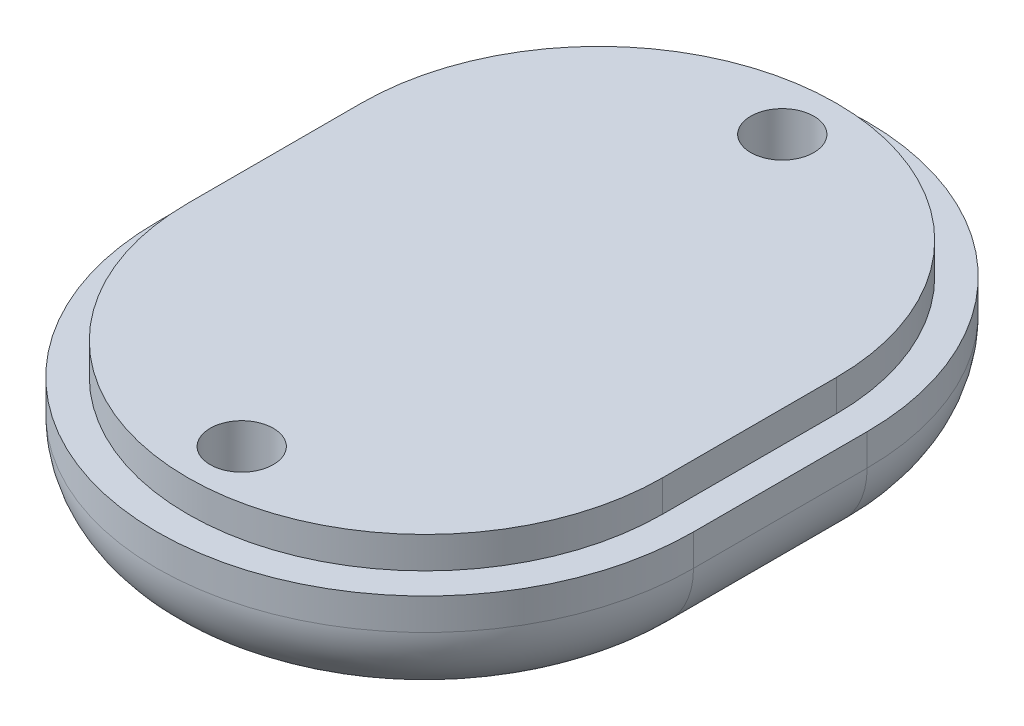
ISO-10303-21;
HEADER;
FILE_DESCRIPTION(('STEP AP214'),'2;1');
FILE_NAME('part.step','',(''),(''),'','','');
FILE_SCHEMA(('AUTOMOTIVE_DESIGN { 1 0 10303 214 1 1 1 1 }'));
ENDSEC;
DATA;
#1=APPLICATION_CONTEXT('core data for automotive mechanical design processes');
#2=APPLICATION_PROTOCOL_DEFINITION('international standard','automotive_design',2000,#1);
#3=PRODUCT_CONTEXT('',#1,'mechanical');
#4=PRODUCT('Part','Part','',(#3));
#5=PRODUCT_RELATED_PRODUCT_CATEGORY('part','',(#4));
#6=PRODUCT_DEFINITION_FORMATION('','',#4);
#7=PRODUCT_DEFINITION_CONTEXT('part definition',#1,'design');
#8=PRODUCT_DEFINITION('design','',#6,#7);
#9=PRODUCT_DEFINITION_SHAPE('','',#8);
#10=(LENGTH_UNIT() NAMED_UNIT(*) SI_UNIT(.MILLI.,.METRE.));
#11=(NAMED_UNIT(*) PLANE_ANGLE_UNIT() SI_UNIT($,.RADIAN.));
#12=(NAMED_UNIT(*) SI_UNIT($,.STERADIAN.) SOLID_ANGLE_UNIT());
#13=UNCERTAINTY_MEASURE_WITH_UNIT(LENGTH_MEASURE(1.E-05),#10,'distance_accuracy_value','');
#14=(GEOMETRIC_REPRESENTATION_CONTEXT(3) GLOBAL_UNCERTAINTY_ASSIGNED_CONTEXT((#13)) GLOBAL_UNIT_ASSIGNED_CONTEXT((#10,
#11,#12)) REPRESENTATION_CONTEXT('',''));
#15=CARTESIAN_POINT('',(0.,0.,0.));
#16=DIRECTION('',(0.,0.,1.));
#17=DIRECTION('',(1.,0.,0.));
#18=AXIS2_PLACEMENT_3D('',#15,#16,#17);
#19=CARTESIAN_POINT('',(0.,-2.,10.5000000050124));
#20=DIRECTION('',(0.,-1.,0.));
#21=DIRECTION('',(0.,0.,-1.));
#22=AXIS2_PLACEMENT_3D('',#19,#20,#21);
#23=TOROIDAL_SURFACE('',#22,12.,5.);
#24=CARTESIAN_POINT('',(0.,-7.,10.5000000050124));
#25=DIRECTION('',(0.,-1.,0.));
#26=DIRECTION('',(0.,0.,-1.));
#27=AXIS2_PLACEMENT_3D('',#24,#25,#26);
#28=CIRCLE('',#27,12.);
#29=CARTESIAN_POINT('',(3.29886472877754,-7.,-1.03765536777572));
#30=VERTEX_POINT('',#29);
#31=CARTESIAN_POINT('',(12.,-7.,10.5000000050124));
#32=VERTEX_POINT('',#31);
#33=EDGE_CURVE('E103',#30,#32,#28,.T.);
#34=ORIENTED_EDGE('',*,*,#33,.F.);
#35=CARTESIAN_POINT('',(-2.15095582379645,-6.44491604313341,-3.62688520277683));
#36=CARTESIAN_POINT('',(-2.29299523066811,-6.49607138539565,-3.50480146174927));
#37=CARTESIAN_POINT('',(-2.4244593430176,-6.54854658033111,-3.37077263728122));
#38=CARTESIAN_POINT('',(-2.66333231790926,-6.65110999181438,-3.08173543058597));
#39=CARTESIAN_POINT('',(-2.7707089573211,-6.70119494115767,-2.92669938508012));
#40=CARTESIAN_POINT('',(-2.95857508108959,-6.79416053492003,-2.59819565696424));
#41=CARTESIAN_POINT('',(-3.03898089034293,-6.83701855748337,-2.42467277458777));
#42=CARTESIAN_POINT('',(-3.13654207637213,-6.89192235242724,-2.15441167271945));
#43=CARTESIAN_POINT('',(-3.16522519817639,-6.90866254035268,-2.06263937805487));
#44=CARTESIAN_POINT('',(-3.21457269271921,-6.9384176899117,-1.87639322048901));
#45=CARTESIAN_POINT('',(-3.23524176523256,-6.95143483371583,-1.78192097596335));
#46=CARTESIAN_POINT('',(-3.26704853494253,-6.97237147220693,-1.59798665717026));
#47=CARTESIAN_POINT('',(-3.27876965695442,-6.98059263688709,-1.50865930376645));
#48=CARTESIAN_POINT('',(-3.29486521537187,-6.99290615716729,-1.32910083985931));
#49=CARTESIAN_POINT('',(-3.29924359801421,-6.99700073006501,-1.23887024103891));
#50=CARTESIAN_POINT('',(-3.30057631323805,-7.00071003676771,-1.058303345196));
#51=CARTESIAN_POINT('',(-3.29753435283314,-7.00032700710584,-0.967967123476838));
#52=CARTESIAN_POINT('',(-3.28406790307035,-6.99482434699182,-0.787995714136846));
#53=CARTESIAN_POINT('',(-3.27364417901765,-6.98970520753954,-0.698360454817564));
#54=CARTESIAN_POINT('',(-3.24718244828752,-6.97544768957246,-0.530780253286197));
#55=CARTESIAN_POINT('',(-3.23191979415802,-6.96683394023048,-0.452667358925257));
#56=CARTESIAN_POINT('',(-3.19594315591847,-6.94577005069983,-0.298226370171511));
#57=CARTESIAN_POINT('',(-3.17522737216502,-6.9333186437741,-0.221898874067906));
#58=CARTESIAN_POINT('',(-3.10530930227205,-6.89029296839226,0.00349570472442764));
#59=CARTESIAN_POINT('',(-3.0483047670786,-6.85403074091191,0.149169836923584));
#60=CARTESIAN_POINT('',(-2.91690308192559,-6.76822808734914,0.426646107789805));
#61=CARTESIAN_POINT('',(-2.84263149510876,-6.71878315972037,0.558538876337853));
#62=CARTESIAN_POINT('',(-2.67937876173015,-6.60892387274925,0.807929739578138));
#63=CARTESIAN_POINT('',(-2.59038691749795,-6.54850153261491,0.92541725660096));
#64=CARTESIAN_POINT('',(-2.42845230103707,-6.43889750816799,1.11254923773304));
#65=CARTESIAN_POINT('',(-2.35855848788305,-6.39168414371101,1.18606005152556));
#66=CARTESIAN_POINT('',(-2.21330131697967,-6.29453796752778,1.32557459798113));
#67=CARTESIAN_POINT('',(-2.13793553770667,-6.2446039542953,1.39157497345171));
#68=CARTESIAN_POINT('',(-1.98199158306874,-6.14326350149107,1.51618818655725));
#69=CARTESIAN_POINT('',(-1.90140442938212,-6.0918546151775,1.57478775920737));
#70=CARTESIAN_POINT('',(-1.73525092429859,-5.98919991250883,1.68449264111673));
#71=CARTESIAN_POINT('',(-1.64968639832912,-5.93795404354983,1.73560067395811));
#72=CARTESIAN_POINT('',(-1.4359750819315,-5.8160615398184,1.85040781265901));
#73=CARTESIAN_POINT('',(-1.30515502808982,-5.74640109039424,1.9102583887146));
#74=CARTESIAN_POINT('',(-1.03217715026464,-5.61836687526717,2.01359087154388));
#75=CARTESIAN_POINT('',(-0.890056687725609,-5.55995793621738,2.05712420499841));
#76=CARTESIAN_POINT('',(-0.638841934457131,-5.47909425208207,2.11509578198157));
#77=CARTESIAN_POINT('',(-0.532699003161883,-5.45110896754402,2.13434835790217));
#78=CARTESIAN_POINT('',(-0.316317880370681,-5.40977416407183,2.1623978934679));
#79=CARTESIAN_POINT('',(-0.206088782001689,-5.39639395355992,2.17121678208942));
#80=CARTESIAN_POINT('',(0.0160602062803459,-5.38670243004756,2.17762933712682));
#81=CARTESIAN_POINT('',(0.127985857070621,-5.39047866550343,2.17516542750049));
#82=CARTESIAN_POINT('',(0.349277089092904,-5.41453158065682,2.15913825802369));
#83=CARTESIAN_POINT('',(0.458638492143372,-5.43483349303788,2.14555802473104));
#84=CARTESIAN_POINT('',(0.708144185664902,-5.4974527815219,2.10217427794147));
#85=CARTESIAN_POINT('',(0.846272000382841,-5.54487790534231,2.0684507287608));
#86=CARTESIAN_POINT('',(1.11239162560186,-5.65349186592114,1.98580071766747));
#87=CARTESIAN_POINT('',(1.24034085270501,-5.71473479547663,1.93681421044904));
#88=CARTESIAN_POINT('',(1.45790359152825,-5.82866561858985,1.83809625437761));
#89=CARTESIAN_POINT('',(1.54952203924972,-5.8800398540375,1.79117674815703));
#90=CARTESIAN_POINT('',(1.7274278105004,-5.98428751546145,1.68941944889604));
#91=CARTESIAN_POINT('',(1.81371238931703,-6.03716169319836,1.63457762681789));
#92=CARTESIAN_POINT('',(1.98089544933116,-6.14243484512198,1.51709280984719));
#93=CARTESIAN_POINT('',(2.06180059230739,-6.19483433493439,1.45445975036485));
#94=CARTESIAN_POINT('',(2.21817606365915,-6.29768840841492,1.32124439299065));
#95=CARTESIAN_POINT('',(2.29364571905815,-6.34814275089304,1.25066111353345));
#96=CARTESIAN_POINT('',(2.42395822857483,-6.43584171285346,1.11661804204915));
#97=CARTESIAN_POINT('',(2.47988489143246,-6.47369352759513,1.05460662215615));
#98=CARTESIAN_POINT('',(2.58757213634777,-6.5466357372352,0.92555459628306));
#99=CARTESIAN_POINT('',(2.6393336653054,-6.58172675973041,0.858515140108697));
#100=CARTESIAN_POINT('',(2.7382071744417,-6.64854161881602,0.719560970430515));
#101=CARTESIAN_POINT('',(2.78532171879386,-6.68026731310866,0.647648982932348));
#102=CARTESIAN_POINT('',(2.87437462888488,-6.73982188222969,0.499200254168412));
#103=CARTESIAN_POINT('',(2.91631567173558,-6.76765277349829,0.422665935605247));
#104=CARTESIAN_POINT('',(2.99483459949237,-6.81920857725805,0.26461105939149));
#105=CARTESIAN_POINT('',(3.03136026242507,-6.84289386275371,0.18305149756806));
#106=CARTESIAN_POINT('',(3.09799324433486,-6.88546278391621,0.0161880130353644));
#107=CARTESIAN_POINT('',(3.12810382749787,-6.9043488625116,-0.069113978637775));
#108=CARTESIAN_POINT('',(3.18140662937964,-6.93708883934525,-0.242791914600383));
#109=CARTESIAN_POINT('',(3.20459965042241,-6.95094332120699,-0.33116750107449));
#110=CARTESIAN_POINT('',(3.24365696575682,-6.97352940630287,-0.510130182731615));
#111=CARTESIAN_POINT('',(3.25952219148649,-6.98226166066284,-0.600716995303079));
#112=CARTESIAN_POINT('',(3.2924454122853,-6.999170806761,-0.850087416876681));
#113=CARTESIAN_POINT('',(3.3018962417681,-7.00227475175436,-1.01031296397912));
#114=CARTESIAN_POINT('',(3.29746446922186,-6.99446553302401,-1.32996439411322));
#115=CARTESIAN_POINT('',(3.28358203685045,-6.98355247121897,-1.4893902829508));
#116=CARTESIAN_POINT('',(3.23336386192724,-6.94996994071139,-1.80277850844909));
#117=CARTESIAN_POINT('',(3.19710365337021,-6.9273400621876,-1.95675738996036));
#118=CARTESIAN_POINT('',(3.10364878673998,-6.87294089787323,-2.25648053609109));
#119=CARTESIAN_POINT('',(3.04644835475857,-6.84116909187021,-2.40222251671913));
#120=CARTESIAN_POINT('',(2.90589809050711,-6.76758238508004,-2.69748094496677));
#121=CARTESIAN_POINT('',(2.82045326992791,-6.72506806382451,-2.84582447946776));
#122=CARTESIAN_POINT('',(2.6284312077978,-6.63587456807751,-3.12679214569672));
#123=CARTESIAN_POINT('',(2.52184061236537,-6.58919277206021,-3.25940625905646));
#124=CARTESIAN_POINT('',(2.27725322931247,-6.49030637162934,-3.51990870165359));
#125=CARTESIAN_POINT('',(2.13711582228331,-6.43804555333839,-3.64577109699374));
#126=CARTESIAN_POINT('',(1.83626211129368,-6.33801423658089,-3.87258657084565));
#127=CARTESIAN_POINT('',(1.67553889378742,-6.29024525604414,-3.9735312474896));
#128=CARTESIAN_POINT('',(1.42108526341732,-6.22584862302382,-4.10409942345269));
#129=CARTESIAN_POINT('',(1.33357583972615,-6.20551082168262,-4.14429255686209));
#130=CARTESIAN_POINT('',(1.15480154122375,-6.16802974267154,-4.2170603997001));
#131=CARTESIAN_POINT('',(1.06353856321309,-6.15088487513899,-4.24963890276616));
#132=CARTESIAN_POINT('',(0.877995491469931,-6.12042987848303,-4.30674557944666));
#133=CARTESIAN_POINT('',(0.783718174886931,-6.10711632654465,-4.33128094137475));
#134=CARTESIAN_POINT('',(0.592870272096209,-6.08483929921578,-4.37198018384006));
#135=CARTESIAN_POINT('',(0.496300040849238,-6.07587515505014,-4.38814535142371));
#136=CARTESIAN_POINT('',(0.312670210164675,-6.06341907079865,-4.41051553969294));
#137=CARTESIAN_POINT('',(0.225754434063091,-6.05942736679076,-4.4176320826764));
#138=CARTESIAN_POINT('',(0.0515091444667616,-6.05531698341643,-4.42495912809929));
#139=CARTESIAN_POINT('',(-0.0358204945921578,-6.05519956624285,-4.42516737990638));
#140=CARTESIAN_POINT('',(-0.210109286339187,-6.05884742507614,-4.41866675332847));
#141=CARTESIAN_POINT('',(-0.2970685696596,-6.06261119422398,-4.41196055945657));
#142=CARTESIAN_POINT('',(-0.469956785736679,-6.07387886777725,-4.39173528099686));
#143=CARTESIAN_POINT('',(-0.55588532138236,-6.08138416908959,-4.37821365183466));
#144=CARTESIAN_POINT('',(-0.79969261543448,-6.10791281054295,-4.32992439220778));
#145=CARTESIAN_POINT('',(-0.955546267156745,-6.13128420755748,-4.28689530285661));
#146=CARTESIAN_POINT('',(-1.25760239853863,-6.18769397370969,-4.17939762616714));
#147=CARTESIAN_POINT('',(-1.40380850251424,-6.22072868697529,-4.11493714559804));
#148=CARTESIAN_POINT('',(-1.65305513426058,-6.28534205548975,-3.98299449553292));
#149=CARTESIAN_POINT('',(-1.75848753494834,-6.31562484997901,-3.91933850354658));
#150=CARTESIAN_POINT('',(-1.96109989631871,-6.37872295718385,-3.78111265493233));
#151=CARTESIAN_POINT('',(-2.0582789236978,-6.41153855551383,-3.70654156659919));
#152=CARTESIAN_POINT('',(-2.15095582379645,-6.44491604313341,-3.62688520277683));
#153=B_SPLINE_CURVE_WITH_KNOTS('',3,(#35,#36,#37,#38,#39,#40,#41,#42,#43,#44,#45,#46,#47,#48,
#49,#50,#51,#52,#53,#54,#55,#56,#57,#58,#59,#60,#61,#62,#63,#64,#65,#66,#67,#68,#69,#70,#71,#72,
#73,#74,#75,#76,#77,#78,#79,#80,#81,#82,#83,#84,#85,#86,#87,#88,#89,#90,#91,#92,#93,#94,#95,#96,
#97,#98,#99,#100,#101,#102,#103,#104,#105,#106,#107,#108,#109,#110,#111,#112,#113,#114,#115,
#116,#117,#118,#119,#120,#121,#122,#123,#124,#125,#126,#127,#128,#129,#130,#131,#132,#133,#134,
#135,#136,#137,#138,#139,#140,#141,#142,#143,#144,#145,#146,#147,#148,#149,#150,#151,#152),
.UNSPECIFIED.,.T.,.F.,(4,2,2,2,2,2,2,2,2,2,2,2,2,2,2,2,2,2,2,2,2,2,2,2,2,2,2,2,2,2,2,2,2,2,2,2,
2,2,2,2,2,2,2,2,2,2,2,2,2,2,2,2,2,2,2,2,2,2,4),(0.,0.582026739383683,1.16482750519809,
1.74941999807523,2.0418520538173,2.33411235480529,2.60513715893351,2.87601625842093,
3.14676006135566,3.4174757990045,3.65733476653595,3.89727299185064,4.37656272670432,
4.85247052048338,5.32872570319584,5.66397848139088,5.99938053492618,6.33537546981034,
6.67124794767611,7.14952103879951,7.62627383337591,7.95937911514536,8.29178304292489,
8.62588511051696,8.9604982700553,9.40764370269813,9.85657092713496,10.2012998785104,
10.5462047693398,10.890674260455,11.2351863278395,11.5099905471283,11.7847321149832,
12.0593212241366,12.333767641279,12.6107090164502,12.8875091371626,13.1642771410952,
13.441009955284,13.920051084494,14.3990887305804,14.8765182093609,15.3540794304234,
15.8811106628879,16.408475789285,16.992300454513,17.5763217082731,17.8712447003458,
18.1660204459881,18.4605320219203,18.7549982986995,19.016541845042,19.2781705980692,
19.5396978127412,19.8013227422184,20.2891446239293,20.7767821886946,21.1564961307076,
21.5362529543146),.UNSPECIFIED.);
#154=CARTESIAN_POINT('',(-3.29886472877755,-7.,-1.03765536777571));
#155=VERTEX_POINT('',#154);
#156=EDGE_CURVE('E12',#30,#155,#153,.T.);
#157=ORIENTED_EDGE('',*,*,#156,.T.);
#158=CARTESIAN_POINT('',(-12.,-7.,10.5000000050124));
#159=VERTEX_POINT('',#158);
#160=EDGE_CURVE('E105',#159,#155,#28,.T.);
#161=ORIENTED_EDGE('',*,*,#160,.F.);
#162=CARTESIAN_POINT('',(-12.,-2.,10.5000000050124));
#163=DIRECTION('',(0.,0.,-1.));
#164=DIRECTION('',(-1.,0.,0.));
#165=AXIS2_PLACEMENT_3D('',#162,#163,#164);
#166=CIRCLE('',#165,5.);
#167=CARTESIAN_POINT('',(-17.,-2.,10.5000000050124));
#168=VERTEX_POINT('',#167);
#169=EDGE_CURVE('E126',#159,#168,#166,.T.);
#170=ORIENTED_EDGE('',*,*,#169,.T.);
#171=CARTESIAN_POINT('',(0.,-2.,10.5000000050124));
#172=DIRECTION('',(0.,-1.,0.));
#173=DIRECTION('',(0.,0.,-1.));
#174=AXIS2_PLACEMENT_3D('',#171,#172,#173);
#175=CIRCLE('',#174,17.);
#176=CARTESIAN_POINT('',(17.,-2.,10.5000000050124));
#177=VERTEX_POINT('',#176);
#178=EDGE_CURVE('E170',#168,#177,#175,.T.);
#179=ORIENTED_EDGE('',*,*,#178,.T.);
#180=CARTESIAN_POINT('',(12.,-2.,10.5000000050124));
#181=DIRECTION('',(0.,0.,1.));
#182=DIRECTION('',(1.,0.,0.));
#183=AXIS2_PLACEMENT_3D('',#180,#181,#182);
#184=CIRCLE('',#183,5.);
#185=EDGE_CURVE('E110',#32,#177,#184,.T.);
#186=ORIENTED_EDGE('',*,*,#185,.F.);
#187=EDGE_LOOP('',(#34,#157,#161,#170,#179,#186));
#188=FACE_BOUND('',#187,.T.);
#189=ADVANCED_FACE('F42',(#188),#23,.T.);
#190=CARTESIAN_POINT('',(0.,-2.,21.5));
#191=DIRECTION('',(0.,-1.,0.));
#192=DIRECTION('',(0.,0.,-1.));
#193=AXIS2_PLACEMENT_3D('',#190,#191,#192);
#194=TOROIDAL_SURFACE('',#193,12.,5.);
#195=CARTESIAN_POINT('',(0.,-7.,21.5));
#196=DIRECTION('',(0.,-1.,0.));
#197=DIRECTION('',(0.,0.,-1.));
#198=AXIS2_PLACEMENT_3D('',#195,#196,#197);
#199=CIRCLE('',#198,12.);
#200=CARTESIAN_POINT('',(-3.29886472877755,-7.,33.0376553727881));
#201=VERTEX_POINT('',#200);
#202=CARTESIAN_POINT('',(-12.,-7.,21.5));
#203=VERTEX_POINT('',#202);
#204=EDGE_CURVE('E162',#201,#203,#199,.T.);
#205=ORIENTED_EDGE('',*,*,#204,.F.);
#206=CARTESIAN_POINT('',(-2.12331202318367,-6.23530549678769,30.598036618083));
#207=CARTESIAN_POINT('',(-2.18856712996583,-6.27813218856242,30.652888763188));
#208=CARTESIAN_POINT('',(-2.25193893694991,-6.32030520384225,30.7104616948668));
#209=CARTESIAN_POINT('',(-2.37466556099987,-6.40257269010548,30.8310959937794));
#210=CARTESIAN_POINT('',(-2.4340216942915,-6.4426678411366,30.8941555470072));
#211=CARTESIAN_POINT('',(-2.54838102893922,-6.52006937031983,31.0257908951688));
#212=CARTESIAN_POINT('',(-2.60338167559568,-6.55737411106326,31.0943698806576));
#213=CARTESIAN_POINT('',(-2.70846210523435,-6.62847011933862,31.2368656764309));
#214=CARTESIAN_POINT('',(-2.75854432219528,-6.66226312520602,31.3107798147715));
#215=CARTESIAN_POINT('',(-2.85370974894391,-6.72605992972405,31.4645117283565));
#216=CARTESIAN_POINT('',(-2.89873656048853,-6.75602141549177,31.5443821749796));
#217=CARTESIAN_POINT('',(-2.98250736899926,-6.81117643224917,31.7088777548965));
#218=CARTESIAN_POINT('',(-3.02125470748306,-6.83637250027737,31.793500326929));
#219=CARTESIAN_POINT('',(-3.09181076877102,-6.88156482144507,31.9668597627507));
#220=CARTESIAN_POINT('',(-3.12362442695149,-6.90156477512619,32.055593645206));
#221=CARTESIAN_POINT('',(-3.17974950498781,-6.9361002978696,32.2364301220854));
#222=CARTESIAN_POINT('',(-3.20406219671078,-6.95063679340953,32.3285321424409));
#223=CARTESIAN_POINT('',(-3.24181925273567,-6.9724629675064,32.5018600359963));
#224=CARTESIAN_POINT('',(-3.25631860539954,-6.98049009739879,32.5827657035373));
#225=CARTESIAN_POINT('',(-3.2792604236489,-6.99248819170541,32.7457569898385));
#226=CARTESIAN_POINT('',(-3.28770096886751,-6.99645787026063,32.8278429743042));
#227=CARTESIAN_POINT('',(-3.2984006727759,-7.00045933296442,32.9924798754124));
#228=CARTESIAN_POINT('',(-3.30066235425686,-7.00049272450899,33.0750305885095));
#229=CARTESIAN_POINT('',(-3.29900151032309,-6.99683662175988,33.2399970147074));
#230=CARTESIAN_POINT('',(-3.29507659736614,-6.99314569036628,33.3224126633952));
#231=CARTESIAN_POINT('',(-3.27475625722008,-6.97739258361241,33.5606482870639));
#232=CARTESIAN_POINT('',(-3.25030156047935,-6.96078117254767,33.7155666562254));
#233=CARTESIAN_POINT('',(-3.18022345284202,-6.91730788266867,34.0189021749456));
#234=CARTESIAN_POINT('',(-3.13459661506701,-6.89044434459162,34.1673182678018));
#235=CARTESIAN_POINT('',(-3.01895564546964,-6.82639954345676,34.4673028603879));
#236=CARTESIAN_POINT('',(-2.9471824650399,-6.78852991526447,34.6180458669602));
#237=CARTESIAN_POINT('',(-2.78263822656336,-6.70709113936931,34.9059106663728));
#238=CARTESIAN_POINT('',(-2.68985577995094,-6.66351890586171,35.043025013255));
#239=CARTESIAN_POINT('',(-2.4734401825414,-6.56881828942695,35.3164429914383));
#240=CARTESIAN_POINT('',(-2.34747743102621,-6.51739953708679,35.4508096673629));
#241=CARTESIAN_POINT('',(-2.07457595529838,-6.41631502071693,35.6971430674923));
#242=CARTESIAN_POINT('',(-1.92762422668913,-6.3666503674692,35.8090958003582));
#243=CARTESIAN_POINT('',(-1.60860224088946,-6.27198448334483,36.0120372611889));
#244=CARTESIAN_POINT('',(-1.43572140919869,-6.22727718321711,36.1019121499969));
#245=CARTESIAN_POINT('',(-1.16496776880477,-6.17000106595885,36.2132886880118));
#246=CARTESIAN_POINT('',(-1.07279214593611,-6.15253739187256,36.24651240929));
#247=CARTESIAN_POINT('',(-0.885269838293304,-6.12150177406262,36.304761216908));
#248=CARTESIAN_POINT('',(-0.789925145535576,-6.1079274353407,36.3297913501037));
#249=CARTESIAN_POINT('',(-0.605503810859459,-6.0862393908935,36.3694289582416));
#250=CARTESIAN_POINT('',(-0.516628017973853,-6.07774622554033,36.3847677181674));
#251=CARTESIAN_POINT('',(-0.33767027906777,-6.06475636607734,36.408126579787));
#252=CARTESIAN_POINT('',(-0.247588973588309,-6.06025762894645,36.4161504228808));
#253=CARTESIAN_POINT('',(-0.0669794508893452,-6.05542585764252,36.4247665166509));
#254=CARTESIAN_POINT('',(0.0235486339175613,-6.05509165562635,36.4253608507534));
#255=CARTESIAN_POINT('',(0.204240291929423,-6.05858976731881,36.4191247474448));
#256=CARTESIAN_POINT('',(0.294403884484679,-6.06242185685102,36.4122947095183));
#257=CARTESIAN_POINT('',(0.545655097485259,-6.07884071828405,36.3828391649231));
#258=CARTESIAN_POINT('',(0.705563820900845,-6.09598627361637,36.3519344506384));
#259=CARTESIAN_POINT('',(1.01752999115461,-6.14146851861157,36.2675857666879));
#260=CARTESIAN_POINT('',(1.16958522928842,-6.16980833736419,36.2141354946648));
#261=CARTESIAN_POINT('',(1.4696716833663,-6.23630881513938,36.08361085676));
#262=CARTESIAN_POINT('',(1.61718486270853,-6.27486570997672,36.0055513506843));
#263=CARTESIAN_POINT('',(1.89774026284984,-6.3574787391754,35.8290368609936));
#264=CARTESIAN_POINT('',(2.03077592680632,-6.4015373460144,35.7305726942888));
#265=CARTESIAN_POINT('',(2.29518492785459,-6.49697126624008,35.5024654445859));
#266=CARTESIAN_POINT('',(2.42448065081416,-6.54859374518849,35.3705073812384));
#267=CARTESIAN_POINT('',(2.65971834842096,-6.64952078877766,35.0863447399242));
#268=CARTESIAN_POINT('',(2.76564804045511,-6.6988241236727,34.9341295806719));
#269=CARTESIAN_POINT('',(2.95484061795047,-6.79218274001412,34.6061039740883));
#270=CARTESIAN_POINT('',(3.03708093128432,-6.83596497806294,34.4296134801368));
#271=CARTESIAN_POINT('',(3.1365639762839,-6.89192693799871,34.1545105711358));
#272=CARTESIAN_POINT('',(3.16575144403054,-6.90896661507375,34.0610472548559));
#273=CARTESIAN_POINT('',(3.21580672190468,-6.93917545089861,33.8713286621215));
#274=CARTESIAN_POINT('',(3.23667969642953,-6.95234701091925,33.7750751587285));
#275=CARTESIAN_POINT('',(3.26830381444283,-6.97323212812413,33.5892571381246));
#276=CARTESIAN_POINT('',(3.27979052314983,-6.98132714337761,33.4998598182215));
#277=CARTESIAN_POINT('',(3.29540838139705,-6.99337296135994,33.3201865460281));
#278=CARTESIAN_POINT('',(3.29954357766689,-6.99732604357388,33.2299111046467));
#279=CARTESIAN_POINT('',(3.30038463529979,-7.00073924938721,33.0492894472741));
#280=CARTESIAN_POINT('',(3.29709481123939,-7.0002019817763,32.9589433028653));
#281=CARTESIAN_POINT('',(3.2831328708381,-6.99438196393444,32.7789808223672));
#282=CARTESIAN_POINT('',(3.27246150088004,-6.9890996934769,32.6893644134178));
#283=CARTESIAN_POINT('',(3.24554839326019,-6.97453606203755,32.521915922386));
#284=CARTESIAN_POINT('',(3.23008638867876,-6.96578316266307,32.4439116375785));
#285=CARTESIAN_POINT('',(3.19372722431536,-6.94444712164547,32.2897061465594));
#286=CARTESIAN_POINT('',(3.17282826823428,-6.93186271388659,32.2135055453564));
#287=CARTESIAN_POINT('',(3.10238796067154,-6.88845187401261,31.9885128560415));
#288=CARTESIAN_POINT('',(3.04507148150766,-6.85195114962661,31.84313734473));
#289=CARTESIAN_POINT('',(2.91304205640075,-6.76567353612148,31.5661109013389));
#290=CARTESIAN_POINT('',(2.83843187826199,-6.71597483126135,31.4343852970112));
#291=CARTESIAN_POINT('',(2.67453439191543,-6.60564535671239,31.1853682979544));
#292=CARTESIAN_POINT('',(2.58523615426306,-6.54500644309043,31.0680877663781));
#293=CARTESIAN_POINT('',(2.42274827889156,-6.4350430023747,30.881269274725));
#294=CARTESIAN_POINT('',(2.35259687014637,-6.38767059803809,30.8078648065337));
#295=CARTESIAN_POINT('',(2.20682258091438,-6.29023410327943,30.6685832141625));
#296=CARTESIAN_POINT('',(2.13119726132414,-6.24016881552795,30.6027094797222));
#297=CARTESIAN_POINT('',(1.97472934853001,-6.13860597519033,30.4783716615523));
#298=CARTESIAN_POINT('',(1.89387799357069,-6.08710610422898,30.4199205354424));
#299=CARTESIAN_POINT('',(1.72718135738296,-5.98432188133178,30.3105329028848));
#300=CARTESIAN_POINT('',(1.64133794840191,-5.93303745623328,30.2595936041822));
#301=CARTESIAN_POINT('',(1.42792114007347,-5.8117092263629,30.1457603705635));
#302=CARTESIAN_POINT('',(1.2977458815279,-5.74265756523957,30.0866079237319));
#303=CARTESIAN_POINT('',(1.02618734211076,-5.61583748151745,29.984485486924));
#304=CARTESIAN_POINT('',(0.884840544840219,-5.55803430411471,29.9414652581349));
#305=CARTESIAN_POINT('',(0.634488104866433,-5.47786998176193,29.8840498053969));
#306=CARTESIAN_POINT('',(0.528359237303693,-5.45008101709389,29.8649468949752));
#307=CARTESIAN_POINT('',(0.312050701614733,-5.40916448669722,29.8371961522402));
#308=CARTESIAN_POINT('',(0.201880299993853,-5.39600531228409,29.828525776356));
#309=CARTESIAN_POINT('',(-0.0200758607842174,-5.38674055384486,29.8223963564013));
#310=CARTESIAN_POINT('',(-0.131866878822793,-5.39071849131451,29.8249922212983));
#311=CARTESIAN_POINT('',(-0.352888948723603,-5.41511375244911,29.8412516394582));
#312=CARTESIAN_POINT('',(-0.462114946174197,-5.43556112084887,29.8549354203793));
#313=CARTESIAN_POINT('',(-0.711833456777339,-5.49857923500063,29.8986205775687));
#314=CARTESIAN_POINT('',(-0.850274261694263,-5.54631880785887,29.9325971368192));
#315=CARTESIAN_POINT('',(-1.11678916827659,-5.65548761855083,30.0157679806615));
#316=CARTESIAN_POINT('',(-1.24483245239274,-5.71695566208429,30.0650055590213));
#317=CARTESIAN_POINT('',(-1.50552854505013,-5.85375633751741,30.1837654350697));
#318=CARTESIAN_POINT('',(-1.63698684535444,-5.92987004516316,30.2549804248225));
#319=CARTESIAN_POINT('',(-1.88865984142456,-6.08309480553359,30.4140272802645));
#320=CARTESIAN_POINT('',(-2.00888156662955,-6.16020519990449,30.5018486518554));
#321=CARTESIAN_POINT('',(-2.12331202318367,-6.23530549678769,30.598036618083));
#322=B_SPLINE_CURVE_WITH_KNOTS('',3,(#206,#207,#208,#209,#210,#211,#212,#213,#214,#215,#216,
#217,#218,#219,#220,#221,#222,#223,#224,#225,#226,#227,#228,#229,#230,#231,#232,#233,#234,#235,
#236,#237,#238,#239,#240,#241,#242,#243,#244,#245,#246,#247,#248,#249,#250,#251,#252,#253,#254,
#255,#256,#257,#258,#259,#260,#261,#262,#263,#264,#265,#266,#267,#268,#269,#270,#271,#272,#273,
#274,#275,#276,#277,#278,#279,#280,#281,#282,#283,#284,#285,#286,#287,#288,#289,#290,#291,#292,
#293,#294,#295,#296,#297,#298,#299,#300,#301,#302,#303,#304,#305,#306,#307,#308,#309,#310,#311,
#312,#313,#314,#315,#316,#317,#318,#319,#320,#321),.UNSPECIFIED.,.T.,.F.,(4,2,2,2,2,2,2,2,2,2,2,
2,2,2,2,2,2,2,2,2,2,2,2,2,2,2,2,2,2,2,2,2,2,2,2,2,2,2,2,2,2,2,2,2,2,2,2,2,2,2,2,2,2,2,2,2,2,4),
(0.,0.286102765462346,0.5721112954841,0.858286359300215,1.14431908265841,1.4332787351408,
1.72208411401868,2.0106832456626,2.29923341538434,2.54666875290661,2.79418248160913,
3.0415951369001,3.2891032975306,3.76005636080157,4.23108567815247,4.74260066286226,
5.25439359289126,5.82552157405799,6.39700496347041,6.9931626953285,7.29135739735233,
7.58936807866057,7.86075918835706,8.13201141017147,8.40318756415022,8.67434912762604,
9.16322624595679,9.65224011505769,10.1640506318831,10.6760919905306,11.2490029227587,
11.8222142980591,12.417361905805,12.7151439662738,13.012740775295,13.2838488163639,
13.5548075764452,13.8256089266819,14.0963828989223,14.3360849684719,14.5758663333108,
15.0548492622152,15.5310556768116,16.0076180550077,16.3433461675387,16.6792248081617,
17.015681957897,17.3520137246754,17.8271397682144,18.3007736419804,18.633609540214,
18.9657249171914,19.2994607581349,19.6338068069627,20.0822628789747,20.5320029976843,
21.0340250567605,21.5357309260429),.UNSPECIFIED.);
#323=CARTESIAN_POINT('',(3.29886472877755,-7.,33.0376553727881));
#324=VERTEX_POINT('',#323);
#325=EDGE_CURVE('E53',#201,#324,#322,.T.);
#326=ORIENTED_EDGE('',*,*,#325,.T.);
#327=CARTESIAN_POINT('',(12.,-7.,21.5));
#328=VERTEX_POINT('',#327);
#329=EDGE_CURVE('E115',#328,#324,#199,.T.);
#330=ORIENTED_EDGE('',*,*,#329,.F.);
#331=CARTESIAN_POINT('',(12.,-2.,21.5));
#332=DIRECTION('',(0.,0.,-1.));
#333=DIRECTION('',(-1.,0.,0.));
#334=AXIS2_PLACEMENT_3D('',#331,#332,#333);
#335=CIRCLE('',#334,5.);
#336=CARTESIAN_POINT('',(17.,-2.,21.5));
#337=VERTEX_POINT('',#336);
#338=EDGE_CURVE('E120',#337,#328,#335,.T.);
#339=ORIENTED_EDGE('',*,*,#338,.F.);
#340=CARTESIAN_POINT('',(0.,-2.,21.5));
#341=DIRECTION('',(0.,-1.,0.));
#342=DIRECTION('',(0.,0.,-1.));
#343=AXIS2_PLACEMENT_3D('',#340,#341,#342);
#344=CIRCLE('',#343,17.);
#345=CARTESIAN_POINT('',(-17.,-2.,21.5));
#346=VERTEX_POINT('',#345);
#347=EDGE_CURVE('E128',#337,#346,#344,.T.);
#348=ORIENTED_EDGE('',*,*,#347,.T.);
#349=CARTESIAN_POINT('',(-12.,-2.,21.5));
#350=DIRECTION('',(0.,0.,1.));
#351=DIRECTION('',(1.,0.,0.));
#352=AXIS2_PLACEMENT_3D('',#349,#350,#351);
#353=CIRCLE('',#352,5.);
#354=EDGE_CURVE('E123',#346,#203,#353,.T.);
#355=ORIENTED_EDGE('',*,*,#354,.T.);
#356=EDGE_LOOP('',(#205,#326,#330,#339,#348,#355));
#357=FACE_BOUND('',#356,.T.);
#358=ADVANCED_FACE('F133',(#357),#194,.T.);
#359=CARTESIAN_POINT('',(0.,-7.,21.5));
#360=DIRECTION('',(0.,-1.,0.));
#361=DIRECTION('',(0.,0.,-1.));
#362=AXIS2_PLACEMENT_3D('',#359,#360,#361);
#363=PLANE('',#362);
#364=ORIENTED_EDGE('',*,*,#160,.T.);
#365=CARTESIAN_POINT('',(0.,-7.,-1.12420882655953));
#366=DIRECTION('',(0.,-1.,0.));
#367=DIRECTION('',(0.,0.,-1.));
#368=AXIS2_PLACEMENT_3D('',#365,#366,#367);
#369=CIRCLE('',#368,3.3);
#370=EDGE_CURVE('E59',#30,#155,#369,.T.);
#371=ORIENTED_EDGE('',*,*,#370,.F.);
#372=ORIENTED_EDGE('',*,*,#33,.T.);
#373=DIRECTION('',(0.,0.,1.));
#374=VECTOR('',#373,1.);
#375=CARTESIAN_POINT('',(12.,-7.,21.5));
#376=LINE('',#375,#374);
#377=EDGE_CURVE('E114',#32,#328,#376,.T.);
#378=ORIENTED_EDGE('',*,*,#377,.T.);
#379=ORIENTED_EDGE('',*,*,#329,.T.);
#380=CARTESIAN_POINT('',(0.,-7.,33.124208831572));
#381=DIRECTION('',(0.,-1.,0.));
#382=DIRECTION('',(0.,0.,-1.));
#383=AXIS2_PLACEMENT_3D('',#380,#381,#382);
#384=CIRCLE('',#383,3.3);
#385=EDGE_CURVE('E65',#201,#324,#384,.T.);
#386=ORIENTED_EDGE('',*,*,#385,.F.);
#387=ORIENTED_EDGE('',*,*,#204,.T.);
#388=DIRECTION('',(0.,0.,-1.));
#389=VECTOR('',#388,1.);
#390=CARTESIAN_POINT('',(-12.,-7.,10.5000000050124));
#391=LINE('',#390,#389);
#392=EDGE_CURVE('E112',#203,#159,#391,.T.);
#393=ORIENTED_EDGE('',*,*,#392,.T.);
#394=EDGE_LOOP('',(#364,#371,#372,#378,#379,#386,#387,#393));
#395=FACE_BOUND('',#394,.T.);
#396=ADVANCED_FACE('F101',(#395),#363,.T.);
#397=CARTESIAN_POINT('',(0.,-2.,21.5));
#398=DIRECTION('',(0.,-1.,0.));
#399=DIRECTION('',(0.,0.,-1.));
#400=AXIS2_PLACEMENT_3D('',#397,#398,#399);
#401=PLANE('',#400);
#402=CARTESIAN_POINT('',(0.,-2.,-1.12420882655953));
#403=DIRECTION('',(0.,-1.,0.));
#404=DIRECTION('',(0.,0.,-1.));
#405=AXIS2_PLACEMENT_3D('',#402,#403,#404);
#406=CIRCLE('',#405,3.3);
#407=CARTESIAN_POINT('',(0.,-2.,-4.42420882655953));
#408=VERTEX_POINT('',#407);
#409=EDGE_CURVE('E107',#408,#408,#406,.T.);
#410=ORIENTED_EDGE('',*,*,#409,.T.);
#411=EDGE_LOOP('',(#410));
#412=FACE_BOUND('',#411,.T.);
#413=CARTESIAN_POINT('',(0.,-2.,33.124208831572));
#414=DIRECTION('',(0.,-1.,0.));
#415=DIRECTION('',(0.,0.,-1.));
#416=AXIS2_PLACEMENT_3D('',#413,#414,#415);
#417=CIRCLE('',#416,3.3);
#418=CARTESIAN_POINT('',(0.,-2.,29.824208831572));
#419=VERTEX_POINT('',#418);
#420=EDGE_CURVE('E106',#419,#419,#417,.T.);
#421=ORIENTED_EDGE('',*,*,#420,.T.);
#422=EDGE_LOOP('',(#421));
#423=FACE_BOUND('',#422,.T.);
#424=ORIENTED_EDGE('',*,*,#347,.F.);
#425=DIRECTION('',(0.,0.,1.));
#426=VECTOR('',#425,1.);
#427=CARTESIAN_POINT('',(17.,-2.,21.5));
#428=LINE('',#427,#426);
#429=EDGE_CURVE('E168',#177,#337,#428,.T.);
#430=ORIENTED_EDGE('',*,*,#429,.F.);
#431=ORIENTED_EDGE('',*,*,#178,.F.);
#432=DIRECTION('',(0.,0.,-1.));
#433=VECTOR('',#432,1.);
#434=CARTESIAN_POINT('',(-17.,-2.,21.5));
#435=LINE('',#434,#433);
#436=EDGE_CURVE('E174',#346,#168,#435,.T.);
#437=ORIENTED_EDGE('',*,*,#436,.F.);
#438=EDGE_LOOP('',(#424,#430,#431,#437));
#439=FACE_BOUND('',#438,.T.);
#440=ADVANCED_FACE('F144',(#412,#423,#439),#401,.F.);
#441=CARTESIAN_POINT('',(-12.,-2.,21.5));
#442=DIRECTION('',(0.,0.,1.));
#443=DIRECTION('',(1.,0.,0.));
#444=AXIS2_PLACEMENT_3D('',#441,#442,#443);
#445=CYLINDRICAL_SURFACE('',#444,5.);
#446=ORIENTED_EDGE('',*,*,#354,.F.);
#447=ORIENTED_EDGE('',*,*,#436,.T.);
#448=ORIENTED_EDGE('',*,*,#169,.F.);
#449=ORIENTED_EDGE('',*,*,#392,.F.);
#450=EDGE_LOOP('',(#446,#447,#448,#449));
#451=FACE_BOUND('',#450,.T.);
#452=ADVANCED_FACE('F44',(#451),#445,.T.);
#453=CARTESIAN_POINT('',(12.,-2.,21.5));
#454=DIRECTION('',(0.,0.,-1.));
#455=DIRECTION('',(-1.,0.,0.));
#456=AXIS2_PLACEMENT_3D('',#453,#454,#455);
#457=CYLINDRICAL_SURFACE('',#456,5.);
#458=ORIENTED_EDGE('',*,*,#185,.T.);
#459=ORIENTED_EDGE('',*,*,#429,.T.);
#460=ORIENTED_EDGE('',*,*,#338,.T.);
#461=ORIENTED_EDGE('',*,*,#377,.F.);
#462=EDGE_LOOP('',(#458,#459,#460,#461));
#463=FACE_BOUND('',#462,.T.);
#464=ADVANCED_FACE('F140',(#463),#457,.T.);
#465=CARTESIAN_POINT('',(0.,-7.,33.124208831572));
#466=DIRECTION('',(0.,1.,0.));
#467=DIRECTION('',(0.,0.,1.));
#468=AXIS2_PLACEMENT_3D('',#465,#466,#467);
#469=CYLINDRICAL_SURFACE('',#468,3.3);
#470=ORIENTED_EDGE('',*,*,#385,.T.);
#471=ORIENTED_EDGE('',*,*,#325,.F.);
#472=EDGE_LOOP('',(#470,#471));
#473=FACE_BOUND('',#472,.T.);
#474=ORIENTED_EDGE('',*,*,#420,.F.);
#475=EDGE_LOOP('',(#474));
#476=FACE_BOUND('',#475,.T.);
#477=ADVANCED_FACE('F136',(#473,#476),#469,.F.);
#478=CARTESIAN_POINT('',(0.,-7.,-1.12420882655953));
#479=DIRECTION('',(0.,1.,0.));
#480=DIRECTION('',(0.,0.,1.));
#481=AXIS2_PLACEMENT_3D('',#478,#479,#480);
#482=CYLINDRICAL_SURFACE('',#481,3.3);
#483=ORIENTED_EDGE('',*,*,#370,.T.);
#484=ORIENTED_EDGE('',*,*,#156,.F.);
#485=EDGE_LOOP('',(#483,#484));
#486=FACE_BOUND('',#485,.T.);
#487=ORIENTED_EDGE('',*,*,#409,.F.);
#488=EDGE_LOOP('',(#487));
#489=FACE_BOUND('',#488,.T.);
#490=ADVANCED_FACE('F94',(#486,#489),#482,.F.);
#491=CLOSED_SHELL('',(#189,#358,#396,#440,#452,#464,#477,#490));
#492=MANIFOLD_SOLID_BREP('B2',#491);
#493=CARTESIAN_POINT('',(0.,2.,21.5));
#494=DIRECTION('',(0.,1.,0.));
#495=DIRECTION('',(0.,0.,1.));
#496=AXIS2_PLACEMENT_3D('',#493,#494,#495);
#497=PLANE('',#496);
#498=CARTESIAN_POINT('',(0.,2.,-1.12420882655953));
#499=DIRECTION('',(0.,1.,0.));
#500=DIRECTION('',(0.,0.,1.));
#501=AXIS2_PLACEMENT_3D('',#498,#499,#500);
#502=CIRCLE('',#501,2.);
#503=CARTESIAN_POINT('',(0.,2.,0.875791173440469));
#504=VERTEX_POINT('',#503);
#505=EDGE_CURVE('E326',#504,#504,#502,.T.);
#506=ORIENTED_EDGE('',*,*,#505,.F.);
#507=EDGE_LOOP('',(#506));
#508=FACE_BOUND('',#507,.T.);
#509=CARTESIAN_POINT('',(0.,2.,21.5));
#510=DIRECTION('',(0.,1.,0.));
#511=DIRECTION('',(0.,0.,1.));
#512=AXIS2_PLACEMENT_3D('',#509,#510,#511);
#513=CIRCLE('',#512,15.05);
#514=CARTESIAN_POINT('',(-15.05,2.,21.5));
#515=VERTEX_POINT('',#514);
#516=CARTESIAN_POINT('',(15.05,2.,21.5));
#517=VERTEX_POINT('',#516);
#518=EDGE_CURVE('E335',#515,#517,#513,.T.);
#519=ORIENTED_EDGE('',*,*,#518,.T.);
#520=DIRECTION('',(0.,0.,-1.));
#521=VECTOR('',#520,1.);
#522=CARTESIAN_POINT('',(15.05,2.,21.5));
#523=LINE('',#522,#521);
#524=CARTESIAN_POINT('',(15.05,2.,10.5));
#525=VERTEX_POINT('',#524);
#526=EDGE_CURVE('E337',#517,#525,#523,.T.);
#527=ORIENTED_EDGE('',*,*,#526,.T.);
#528=CARTESIAN_POINT('',(0.,2.,10.5000000050124));
#529=DIRECTION('',(0.,1.,0.));
#530=DIRECTION('',(0.,0.,1.));
#531=AXIS2_PLACEMENT_3D('',#528,#529,#530);
#532=CIRCLE('',#531,15.05);
#533=CARTESIAN_POINT('',(-15.05,2.,10.5));
#534=VERTEX_POINT('',#533);
#535=EDGE_CURVE('E340',#525,#534,#532,.T.);
#536=ORIENTED_EDGE('',*,*,#535,.T.);
#537=DIRECTION('',(0.,0.,1.));
#538=VECTOR('',#537,1.);
#539=CARTESIAN_POINT('',(-15.05,2.,10.5));
#540=LINE('',#539,#538);
#541=EDGE_CURVE('E253',#534,#515,#540,.T.);
#542=ORIENTED_EDGE('',*,*,#541,.T.);
#543=EDGE_LOOP('',(#519,#527,#536,#542));
#544=FACE_BOUND('',#543,.T.);
#545=CARTESIAN_POINT('',(0.,2.,33.124208831572));
#546=DIRECTION('',(0.,1.,0.));
#547=DIRECTION('',(0.,0.,1.));
#548=AXIS2_PLACEMENT_3D('',#545,#546,#547);
#549=CIRCLE('',#548,2.);
#550=CARTESIAN_POINT('',(0.,2.,35.124208831572));
#551=VERTEX_POINT('',#550);
#552=EDGE_CURVE('E323',#551,#551,#549,.T.);
#553=ORIENTED_EDGE('',*,*,#552,.F.);
#554=EDGE_LOOP('',(#553));
#555=FACE_BOUND('',#554,.T.);
#556=ADVANCED_FACE('F235',(#508,#544,#555),#497,.T.);
#557=CARTESIAN_POINT('',(0.,2.,21.5));
#558=DIRECTION('',(0.,-1.,0.));
#559=DIRECTION('',(0.,0.,-1.));
#560=AXIS2_PLACEMENT_3D('',#557,#558,#559);
#561=CYLINDRICAL_SURFACE('',#560,15.05);
#562=CARTESIAN_POINT('',(0.,0.,21.5));
#563=DIRECTION('',(0.,1.,0.));
#564=DIRECTION('',(0.,0.,1.));
#565=AXIS2_PLACEMENT_3D('',#562,#563,#564);
#566=CIRCLE('',#565,15.05);
#567=CARTESIAN_POINT('',(-15.05,0.,21.5));
#568=VERTEX_POINT('',#567);
#569=CARTESIAN_POINT('',(15.05,0.,21.5));
#570=VERTEX_POINT('',#569);
#571=EDGE_CURVE('E334',#568,#570,#566,.T.);
#572=ORIENTED_EDGE('',*,*,#571,.T.);
#573=DIRECTION('',(0.,-1.,0.));
#574=VECTOR('',#573,1.);
#575=CARTESIAN_POINT('',(15.05,2.,21.5));
#576=LINE('',#575,#574);
#577=EDGE_CURVE('E40',#517,#570,#576,.T.);
#578=ORIENTED_EDGE('',*,*,#577,.F.);
#579=ORIENTED_EDGE('',*,*,#518,.F.);
#580=DIRECTION('',(0.,-1.,0.));
#581=VECTOR('',#580,1.);
#582=CARTESIAN_POINT('',(-15.05,2.,21.5));
#583=LINE('',#582,#581);
#584=EDGE_CURVE('E343',#515,#568,#583,.T.);
#585=ORIENTED_EDGE('',*,*,#584,.T.);
#586=EDGE_LOOP('',(#572,#578,#579,#585));
#587=FACE_BOUND('',#586,.T.);
#588=ADVANCED_FACE('F237',(#587),#561,.T.);
#589=CARTESIAN_POINT('',(15.05,2.,21.5));
#590=DIRECTION('',(-1.,0.,0.));
#591=DIRECTION('',(0.,0.,1.));
#592=AXIS2_PLACEMENT_3D('',#589,#590,#591);
#593=PLANE('',#592);
#594=DIRECTION('',(0.,0.,-1.));
#595=VECTOR('',#594,1.);
#596=CARTESIAN_POINT('',(15.05,0.,21.5));
#597=LINE('',#596,#595);
#598=CARTESIAN_POINT('',(15.05,0.,10.5));
#599=VERTEX_POINT('',#598);
#600=EDGE_CURVE('E346',#570,#599,#597,.T.);
#601=ORIENTED_EDGE('',*,*,#600,.T.);
#602=DIRECTION('',(0.,-1.,0.));
#603=VECTOR('',#602,1.);
#604=CARTESIAN_POINT('',(15.05,2.,10.5));
#605=LINE('',#604,#603);
#606=EDGE_CURVE('E245',#525,#599,#605,.T.);
#607=ORIENTED_EDGE('',*,*,#606,.F.);
#608=ORIENTED_EDGE('',*,*,#526,.F.);
#609=ORIENTED_EDGE('',*,*,#577,.T.);
#610=EDGE_LOOP('',(#601,#607,#608,#609));
#611=FACE_BOUND('',#610,.T.);
#612=ADVANCED_FACE('F401',(#611),#593,.F.);
#613=CARTESIAN_POINT('',(0.,2.,10.5000000050124));
#614=DIRECTION('',(0.,-1.,0.));
#615=DIRECTION('',(0.,0.,-1.));
#616=AXIS2_PLACEMENT_3D('',#613,#614,#615);
#617=CYLINDRICAL_SURFACE('',#616,15.05);
#618=CARTESIAN_POINT('',(0.,0.,10.5000000050124));
#619=DIRECTION('',(0.,1.,0.));
#620=DIRECTION('',(0.,0.,1.));
#621=AXIS2_PLACEMENT_3D('',#618,#619,#620);
#622=CIRCLE('',#621,15.05);
#623=CARTESIAN_POINT('',(-15.05,0.,10.5));
#624=VERTEX_POINT('',#623);
#625=EDGE_CURVE('E349',#599,#624,#622,.T.);
#626=ORIENTED_EDGE('',*,*,#625,.T.);
#627=DIRECTION('',(0.,-1.,0.));
#628=VECTOR('',#627,1.);
#629=CARTESIAN_POINT('',(-15.05,2.,10.5));
#630=LINE('',#629,#628);
#631=EDGE_CURVE('E356',#534,#624,#630,.T.);
#632=ORIENTED_EDGE('',*,*,#631,.F.);
#633=ORIENTED_EDGE('',*,*,#535,.F.);
#634=ORIENTED_EDGE('',*,*,#606,.T.);
#635=EDGE_LOOP('',(#626,#632,#633,#634));
#636=FACE_BOUND('',#635,.T.);
#637=ADVANCED_FACE('F411',(#636),#617,.T.);
#638=CARTESIAN_POINT('',(-15.05,2.,10.5));
#639=DIRECTION('',(1.,0.,0.));
#640=DIRECTION('',(0.,0.,-1.));
#641=AXIS2_PLACEMENT_3D('',#638,#639,#640);
#642=PLANE('',#641);
#643=DIRECTION('',(0.,0.,1.));
#644=VECTOR('',#643,1.);
#645=CARTESIAN_POINT('',(-15.05,0.,10.5));
#646=LINE('',#645,#644);
#647=EDGE_CURVE('E338',#624,#568,#646,.T.);
#648=ORIENTED_EDGE('',*,*,#647,.T.);
#649=ORIENTED_EDGE('',*,*,#584,.F.);
#650=ORIENTED_EDGE('',*,*,#541,.F.);
#651=ORIENTED_EDGE('',*,*,#631,.T.);
#652=EDGE_LOOP('',(#648,#649,#650,#651));
#653=FACE_BOUND('',#652,.T.);
#654=ADVANCED_FACE('F408',(#653),#642,.F.);
#655=CARTESIAN_POINT('',(0.,2.,-1.12420882655953));
#656=DIRECTION('',(0.,-1.,0.));
#657=DIRECTION('',(0.,0.,-1.));
#658=AXIS2_PLACEMENT_3D('',#655,#656,#657);
#659=CYLINDRICAL_SURFACE('',#658,2.);
#660=ORIENTED_EDGE('',*,*,#505,.T.);
#661=EDGE_LOOP('',(#660));
#662=FACE_BOUND('',#661,.T.);
#663=CARTESIAN_POINT('',(0.,-2.,-1.12420882655953));
#664=DIRECTION('',(0.,-1.,0.));
#665=DIRECTION('',(0.,0.,-1.));
#666=AXIS2_PLACEMENT_3D('',#663,#664,#665);
#667=CIRCLE('',#666,2.);
#668=CARTESIAN_POINT('',(0.,-2.,-3.12420882655953));
#669=VERTEX_POINT('',#668);
#670=EDGE_CURVE('E239',#669,#669,#667,.T.);
#671=ORIENTED_EDGE('',*,*,#670,.T.);
#672=EDGE_LOOP('',(#671));
#673=FACE_BOUND('',#672,.T.);
#674=ADVANCED_FACE('F406',(#662,#673),#659,.F.);
#675=CARTESIAN_POINT('',(0.,2.,33.124208831572));
#676=DIRECTION('',(0.,-1.,0.));
#677=DIRECTION('',(0.,0.,-1.));
#678=AXIS2_PLACEMENT_3D('',#675,#676,#677);
#679=CYLINDRICAL_SURFACE('',#678,2.);
#680=ORIENTED_EDGE('',*,*,#552,.T.);
#681=EDGE_LOOP('',(#680));
#682=FACE_BOUND('',#681,.T.);
#683=CARTESIAN_POINT('',(0.,-2.,33.124208831572));
#684=DIRECTION('',(0.,-1.,0.));
#685=DIRECTION('',(0.,0.,-1.));
#686=AXIS2_PLACEMENT_3D('',#683,#684,#685);
#687=CIRCLE('',#686,2.);
#688=CARTESIAN_POINT('',(0.,-2.,31.124208831572));
#689=VERTEX_POINT('',#688);
#690=EDGE_CURVE('E360',#689,#689,#687,.T.);
#691=ORIENTED_EDGE('',*,*,#690,.T.);
#692=EDGE_LOOP('',(#691));
#693=FACE_BOUND('',#692,.T.);
#694=ADVANCED_FACE('F457',(#682,#693),#679,.F.);
#695=CARTESIAN_POINT('',(0.,-2.,10.5000000050124));
#696=DIRECTION('',(0.,1.,0.));
#697=DIRECTION('',(0.,0.,1.));
#698=AXIS2_PLACEMENT_3D('',#695,#696,#697);
#699=CYLINDRICAL_SURFACE('',#698,17.);
#700=CARTESIAN_POINT('',(0.,0.,10.5000000050124));
#701=DIRECTION('',(0.,-1.,0.));
#702=DIRECTION('',(0.,0.,-1.));
#703=AXIS2_PLACEMENT_3D('',#700,#701,#702);
#704=CIRCLE('',#703,17.);
#705=CARTESIAN_POINT('',(-17.,0.,10.5));
#706=VERTEX_POINT('',#705);
#707=CARTESIAN_POINT('',(17.,0.,10.4999999993506));
#708=VERTEX_POINT('',#707);
#709=EDGE_CURVE('E322',#706,#708,#704,.T.);
#710=ORIENTED_EDGE('',*,*,#709,.T.);
#711=DIRECTION('',(0.,1.,0.));
#712=VECTOR('',#711,1.);
#713=CARTESIAN_POINT('',(17.,-2.,10.4999999993506));
#714=LINE('',#713,#712);
#715=CARTESIAN_POINT('',(17.,-2.,10.4999999993506));
#716=VERTEX_POINT('',#715);
#717=EDGE_CURVE('E302',#716,#708,#714,.T.);
#718=ORIENTED_EDGE('',*,*,#717,.F.);
#719=CARTESIAN_POINT('',(0.,-2.,10.5000000050124));
#720=DIRECTION('',(0.,-1.,0.));
#721=DIRECTION('',(0.,0.,-1.));
#722=AXIS2_PLACEMENT_3D('',#719,#720,#721);
#723=CIRCLE('',#722,17.);
#724=CARTESIAN_POINT('',(-17.,-2.,10.5));
#725=VERTEX_POINT('',#724);
#726=EDGE_CURVE('E309',#725,#716,#723,.T.);
#727=ORIENTED_EDGE('',*,*,#726,.F.);
#728=DIRECTION('',(0.,1.,0.));
#729=VECTOR('',#728,1.);
#730=CARTESIAN_POINT('',(-17.,-2.,10.5));
#731=LINE('',#730,#729);
#732=EDGE_CURVE('E376',#725,#706,#731,.T.);
#733=ORIENTED_EDGE('',*,*,#732,.T.);
#734=EDGE_LOOP('',(#710,#718,#727,#733));
#735=FACE_BOUND('',#734,.T.);
#736=ADVANCED_FACE('F320',(#735),#699,.T.);
#737=CARTESIAN_POINT('',(17.,-2.,10.4999999993506));
#738=DIRECTION('',(-1.,0.,0.));
#739=DIRECTION('',(0.,0.,1.));
#740=AXIS2_PLACEMENT_3D('',#737,#738,#739);
#741=PLANE('',#740);
#742=DIRECTION('',(0.,0.,1.));
#743=VECTOR('',#742,1.);
#744=CARTESIAN_POINT('',(17.,0.,10.4999999993506));
#745=LINE('',#744,#743);
#746=CARTESIAN_POINT('',(17.,0.,21.5));
#747=VERTEX_POINT('',#746);
#748=EDGE_CURVE('E367',#708,#747,#745,.T.);
#749=ORIENTED_EDGE('',*,*,#748,.T.);
#750=DIRECTION('',(0.,1.,0.));
#751=VECTOR('',#750,1.);
#752=CARTESIAN_POINT('',(17.,-2.,21.5));
#753=LINE('',#752,#751);
#754=CARTESIAN_POINT('',(17.,-2.,21.5));
#755=VERTEX_POINT('',#754);
#756=EDGE_CURVE('E305',#755,#747,#753,.T.);
#757=ORIENTED_EDGE('',*,*,#756,.F.);
#758=DIRECTION('',(0.,0.,1.));
#759=VECTOR('',#758,1.);
#760=CARTESIAN_POINT('',(17.,-2.,10.4999999993506));
#761=LINE('',#760,#759);
#762=EDGE_CURVE('E298',#716,#755,#761,.T.);
#763=ORIENTED_EDGE('',*,*,#762,.F.);
#764=ORIENTED_EDGE('',*,*,#717,.T.);
#765=EDGE_LOOP('',(#749,#757,#763,#764));
#766=FACE_BOUND('',#765,.T.);
#767=ADVANCED_FACE('F300',(#766),#741,.F.);
#768=CARTESIAN_POINT('',(0.,-2.,21.5));
#769=DIRECTION('',(0.,1.,0.));
#770=DIRECTION('',(0.,0.,1.));
#771=AXIS2_PLACEMENT_3D('',#768,#769,#770);
#772=CYLINDRICAL_SURFACE('',#771,17.);
#773=CARTESIAN_POINT('',(0.,0.,21.5));
#774=DIRECTION('',(0.,-1.,0.));
#775=DIRECTION('',(0.,0.,-1.));
#776=AXIS2_PLACEMENT_3D('',#773,#774,#775);
#777=CIRCLE('',#776,17.);
#778=CARTESIAN_POINT('',(-17.,0.,21.5));
#779=VERTEX_POINT('',#778);
#780=EDGE_CURVE('E369',#747,#779,#777,.T.);
#781=ORIENTED_EDGE('',*,*,#780,.T.);
#782=DIRECTION('',(0.,1.,0.));
#783=VECTOR('',#782,1.);
#784=CARTESIAN_POINT('',(-17.,-2.,21.5));
#785=LINE('',#784,#783);
#786=CARTESIAN_POINT('',(-17.,-2.,21.5));
#787=VERTEX_POINT('',#786);
#788=EDGE_CURVE('E328',#787,#779,#785,.T.);
#789=ORIENTED_EDGE('',*,*,#788,.F.);
#790=CARTESIAN_POINT('',(0.,-2.,21.5));
#791=DIRECTION('',(0.,-1.,0.));
#792=DIRECTION('',(0.,0.,-1.));
#793=AXIS2_PLACEMENT_3D('',#790,#791,#792);
#794=CIRCLE('',#793,17.);
#795=EDGE_CURVE('E308',#755,#787,#794,.T.);
#796=ORIENTED_EDGE('',*,*,#795,.F.);
#797=ORIENTED_EDGE('',*,*,#756,.T.);
#798=EDGE_LOOP('',(#781,#789,#796,#797));
#799=FACE_BOUND('',#798,.T.);
#800=ADVANCED_FACE('F386',(#799),#772,.T.);
#801=CARTESIAN_POINT('',(-17.,-2.,21.5));
#802=DIRECTION('',(1.,0.,0.));
#803=DIRECTION('',(0.,0.,-1.));
#804=AXIS2_PLACEMENT_3D('',#801,#802,#803);
#805=PLANE('',#804);
#806=DIRECTION('',(0.,0.,-1.));
#807=VECTOR('',#806,1.);
#808=CARTESIAN_POINT('',(-17.,0.,21.5));
#809=LINE('',#808,#807);
#810=EDGE_CURVE('E318',#779,#706,#809,.T.);
#811=ORIENTED_EDGE('',*,*,#810,.T.);
#812=ORIENTED_EDGE('',*,*,#732,.F.);
#813=DIRECTION('',(0.,0.,-1.));
#814=VECTOR('',#813,1.);
#815=CARTESIAN_POINT('',(-17.,-2.,21.5));
#816=LINE('',#815,#814);
#817=EDGE_CURVE('E314',#787,#725,#816,.T.);
#818=ORIENTED_EDGE('',*,*,#817,.F.);
#819=ORIENTED_EDGE('',*,*,#788,.T.);
#820=EDGE_LOOP('',(#811,#812,#818,#819));
#821=FACE_BOUND('',#820,.T.);
#822=ADVANCED_FACE('F381',(#821),#805,.F.);
#823=CARTESIAN_POINT('',(0.,-2.,10.5000000050124));
#824=DIRECTION('',(0.,-1.,0.));
#825=DIRECTION('',(0.,0.,-1.));
#826=AXIS2_PLACEMENT_3D('',#823,#824,#825);
#827=PLANE('',#826);
#828=ORIENTED_EDGE('',*,*,#670,.F.);
#829=EDGE_LOOP('',(#828));
#830=FACE_BOUND('',#829,.T.);
#831=ORIENTED_EDGE('',*,*,#690,.F.);
#832=EDGE_LOOP('',(#831));
#833=FACE_BOUND('',#832,.T.);
#834=ORIENTED_EDGE('',*,*,#726,.T.);
#835=ORIENTED_EDGE('',*,*,#762,.T.);
#836=ORIENTED_EDGE('',*,*,#795,.T.);
#837=ORIENTED_EDGE('',*,*,#817,.T.);
#838=EDGE_LOOP('',(#834,#835,#836,#837));
#839=FACE_BOUND('',#838,.T.);
#840=ADVANCED_FACE('F312',(#830,#833,#839),#827,.T.);
#841=CARTESIAN_POINT('',(0.,0.,10.5000000050124));
#842=DIRECTION('',(0.,-1.,0.));
#843=DIRECTION('',(0.,0.,-1.));
#844=AXIS2_PLACEMENT_3D('',#841,#842,#843);
#845=PLANE('',#844);
#846=ORIENTED_EDGE('',*,*,#600,.F.);
#847=ORIENTED_EDGE('',*,*,#571,.F.);
#848=ORIENTED_EDGE('',*,*,#647,.F.);
#849=ORIENTED_EDGE('',*,*,#625,.F.);
#850=EDGE_LOOP('',(#846,#847,#848,#849));
#851=FACE_BOUND('',#850,.T.);
#852=ORIENTED_EDGE('',*,*,#709,.F.);
#853=ORIENTED_EDGE('',*,*,#810,.F.);
#854=ORIENTED_EDGE('',*,*,#780,.F.);
#855=ORIENTED_EDGE('',*,*,#748,.F.);
#856=EDGE_LOOP('',(#852,#853,#854,#855));
#857=FACE_BOUND('',#856,.T.);
#858=ADVANCED_FACE('F385',(#851,#857),#845,.F.);
#859=CLOSED_SHELL('',(#556,#588,#612,#637,#654,#674,#694,#736,#767,#800,#822,#840,#858));
#860=MANIFOLD_SOLID_BREP('B6',#859);
#861=ADVANCED_BREP_SHAPE_REPRESENTATION('',(#18,#492,#860),#14);
#862=SHAPE_DEFINITION_REPRESENTATION(#9,#861);
ENDSEC;
END-ISO-10303-21;
